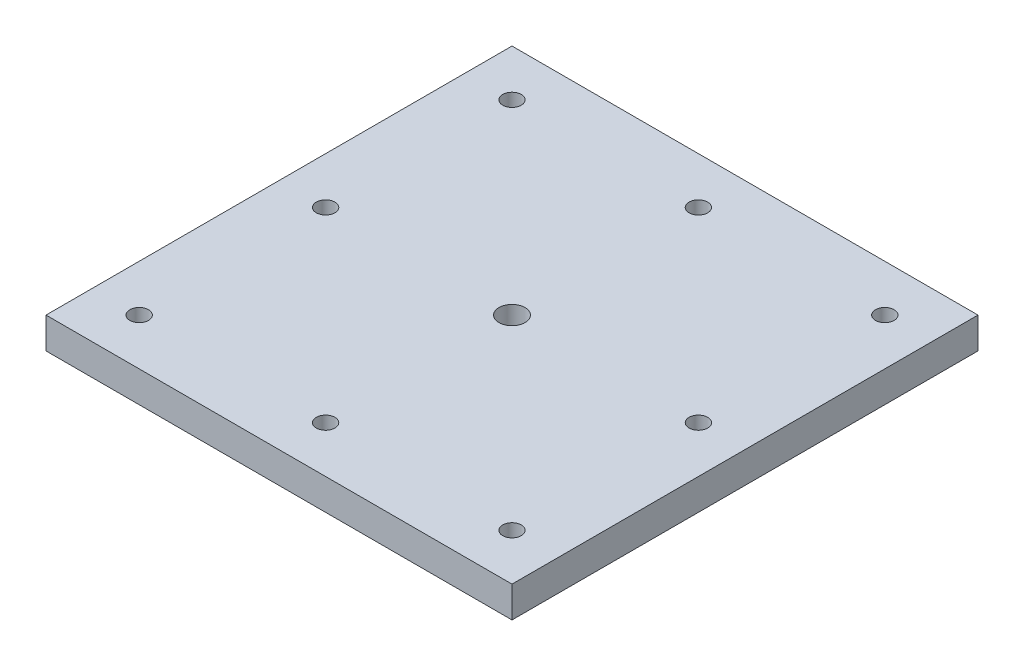
ISO-10303-21;
HEADER;
FILE_DESCRIPTION(('STEP AP214'),'2;1');
FILE_NAME('part.step','',(''),(''),'','','');
FILE_SCHEMA(('AUTOMOTIVE_DESIGN { 1 0 10303 214 1 1 1 1 }'));
ENDSEC;
DATA;
#1=APPLICATION_CONTEXT('core data for automotive mechanical design processes');
#2=APPLICATION_PROTOCOL_DEFINITION('international standard','automotive_design',2000,#1);
#3=PRODUCT_CONTEXT('',#1,'mechanical');
#4=PRODUCT('Part','Part','',(#3));
#5=PRODUCT_RELATED_PRODUCT_CATEGORY('part','',(#4));
#6=PRODUCT_DEFINITION_FORMATION('','',#4);
#7=PRODUCT_DEFINITION_CONTEXT('part definition',#1,'design');
#8=PRODUCT_DEFINITION('design','',#6,#7);
#9=PRODUCT_DEFINITION_SHAPE('','',#8);
#10=(LENGTH_UNIT() NAMED_UNIT(*) SI_UNIT(.MILLI.,.METRE.));
#11=(NAMED_UNIT(*) PLANE_ANGLE_UNIT() SI_UNIT($,.RADIAN.));
#12=(NAMED_UNIT(*) SI_UNIT($,.STERADIAN.) SOLID_ANGLE_UNIT());
#13=UNCERTAINTY_MEASURE_WITH_UNIT(LENGTH_MEASURE(1.E-05),#10,'distance_accuracy_value','');
#14=(GEOMETRIC_REPRESENTATION_CONTEXT(3) GLOBAL_UNCERTAINTY_ASSIGNED_CONTEXT((#13)) GLOBAL_UNIT_ASSIGNED_CONTEXT((#10,
#11,#12)) REPRESENTATION_CONTEXT('',''));
#15=CARTESIAN_POINT('',(0.,0.,0.));
#16=DIRECTION('',(0.,0.,1.));
#17=DIRECTION('',(1.,0.,0.));
#18=AXIS2_PLACEMENT_3D('',#15,#16,#17);
#19=CARTESIAN_POINT('',(0.,5.,0.));
#20=DIRECTION('',(0.,1.,0.));
#21=DIRECTION('',(0.,0.,1.));
#22=AXIS2_PLACEMENT_3D('',#19,#20,#21);
#23=PLANE('',#22);
#24=CARTESIAN_POINT('',(0.,5.,30.));
#25=DIRECTION('',(0.,1.,0.));
#26=DIRECTION('',(0.,0.,1.));
#27=AXIS2_PLACEMENT_3D('',#24,#25,#26);
#28=CIRCLE('',#27,1.5);
#29=CARTESIAN_POINT('',(0.,5.,31.5));
#30=VERTEX_POINT('',#29);
#31=EDGE_CURVE('E151',#30,#30,#28,.T.);
#32=ORIENTED_EDGE('',*,*,#31,.F.);
#33=EDGE_LOOP('',(#32));
#34=FACE_BOUND('',#33,.T.);
#35=CARTESIAN_POINT('',(-30.,5.,30.));
#36=DIRECTION('',(0.,1.,0.));
#37=DIRECTION('',(0.,0.,1.));
#38=AXIS2_PLACEMENT_3D('',#35,#36,#37);
#39=CIRCLE('',#38,1.5);
#40=CARTESIAN_POINT('',(-30.,5.,31.5));
#41=VERTEX_POINT('',#40);
#42=EDGE_CURVE('E139',#41,#41,#39,.T.);
#43=ORIENTED_EDGE('',*,*,#42,.F.);
#44=EDGE_LOOP('',(#43));
#45=FACE_BOUND('',#44,.T.);
#46=CARTESIAN_POINT('',(-30.,5.,-30.));
#47=DIRECTION('',(0.,1.,0.));
#48=DIRECTION('',(0.,0.,1.));
#49=AXIS2_PLACEMENT_3D('',#46,#47,#48);
#50=CIRCLE('',#49,1.5);
#51=CARTESIAN_POINT('',(-30.,5.,-28.5));
#52=VERTEX_POINT('',#51);
#53=EDGE_CURVE('E127',#52,#52,#50,.T.);
#54=ORIENTED_EDGE('',*,*,#53,.F.);
#55=EDGE_LOOP('',(#54));
#56=FACE_BOUND('',#55,.T.);
#57=CARTESIAN_POINT('',(30.,5.,-30.));
#58=DIRECTION('',(0.,1.,0.));
#59=DIRECTION('',(0.,0.,1.));
#60=AXIS2_PLACEMENT_3D('',#57,#58,#59);
#61=CIRCLE('',#60,1.5);
#62=CARTESIAN_POINT('',(30.,5.,-28.5));
#63=VERTEX_POINT('',#62);
#64=EDGE_CURVE('E115',#63,#63,#61,.T.);
#65=ORIENTED_EDGE('',*,*,#64,.F.);
#66=EDGE_LOOP('',(#65));
#67=FACE_BOUND('',#66,.T.);
#68=DIRECTION('',(0.,0.,-1.));
#69=VECTOR('',#68,1.);
#70=CARTESIAN_POINT('',(37.5,5.,-37.5));
#71=LINE('',#70,#69);
#72=CARTESIAN_POINT('',(37.5,5.,37.5));
#73=VERTEX_POINT('',#72);
#74=CARTESIAN_POINT('',(37.5,5.,-37.5));
#75=VERTEX_POINT('',#74);
#76=EDGE_CURVE('E85',#73,#75,#71,.T.);
#77=ORIENTED_EDGE('',*,*,#76,.T.);
#78=DIRECTION('',(-1.,0.,0.));
#79=VECTOR('',#78,1.);
#80=CARTESIAN_POINT('',(-37.5,5.,-37.5));
#81=LINE('',#80,#79);
#82=CARTESIAN_POINT('',(-37.5,5.,-37.5));
#83=VERTEX_POINT('',#82);
#84=EDGE_CURVE('E80',#75,#83,#81,.T.);
#85=ORIENTED_EDGE('',*,*,#84,.T.);
#86=DIRECTION('',(0.,0.,1.));
#87=VECTOR('',#86,1.);
#88=CARTESIAN_POINT('',(-37.5,5.,-37.5));
#89=LINE('',#88,#87);
#90=CARTESIAN_POINT('',(-37.5,5.,37.5));
#91=VERTEX_POINT('',#90);
#92=EDGE_CURVE('E83',#83,#91,#89,.T.);
#93=ORIENTED_EDGE('',*,*,#92,.T.);
#94=DIRECTION('',(1.,0.,0.));
#95=VECTOR('',#94,1.);
#96=CARTESIAN_POINT('',(-37.5,5.,37.5));
#97=LINE('',#96,#95);
#98=EDGE_CURVE('E50',#91,#73,#97,.T.);
#99=ORIENTED_EDGE('',*,*,#98,.T.);
#100=EDGE_LOOP('',(#77,#85,#93,#99));
#101=FACE_BOUND('',#100,.T.);
#102=CARTESIAN_POINT('',(30.,5.,0.));
#103=DIRECTION('',(0.,1.,0.));
#104=DIRECTION('',(0.,0.,1.));
#105=AXIS2_PLACEMENT_3D('',#102,#103,#104);
#106=CIRCLE('',#105,1.5);
#107=CARTESIAN_POINT('',(30.,5.,1.5));
#108=VERTEX_POINT('',#107);
#109=EDGE_CURVE('E100',#108,#108,#106,.T.);
#110=ORIENTED_EDGE('',*,*,#109,.F.);
#111=EDGE_LOOP('',(#110));
#112=FACE_BOUND('',#111,.T.);
#113=CARTESIAN_POINT('',(0.,5.,-30.));
#114=DIRECTION('',(0.,1.,0.));
#115=DIRECTION('',(0.,0.,1.));
#116=AXIS2_PLACEMENT_3D('',#113,#114,#115);
#117=CIRCLE('',#116,1.5);
#118=CARTESIAN_POINT('',(0.,5.,-28.5));
#119=VERTEX_POINT('',#118);
#120=EDGE_CURVE('E121',#119,#119,#117,.T.);
#121=ORIENTED_EDGE('',*,*,#120,.F.);
#122=EDGE_LOOP('',(#121));
#123=FACE_BOUND('',#122,.T.);
#124=CARTESIAN_POINT('',(-30.,5.,0.));
#125=DIRECTION('',(0.,1.,0.));
#126=DIRECTION('',(0.,0.,1.));
#127=AXIS2_PLACEMENT_3D('',#124,#125,#126);
#128=CIRCLE('',#127,1.5);
#129=CARTESIAN_POINT('',(-30.,5.,1.5));
#130=VERTEX_POINT('',#129);
#131=EDGE_CURVE('E133',#130,#130,#128,.T.);
#132=ORIENTED_EDGE('',*,*,#131,.F.);
#133=EDGE_LOOP('',(#132));
#134=FACE_BOUND('',#133,.T.);
#135=CARTESIAN_POINT('',(30.,5.,30.));
#136=DIRECTION('',(0.,1.,0.));
#137=DIRECTION('',(0.,0.,1.));
#138=AXIS2_PLACEMENT_3D('',#135,#136,#137);
#139=CIRCLE('',#138,1.5);
#140=CARTESIAN_POINT('',(30.,5.,31.5));
#141=VERTEX_POINT('',#140);
#142=EDGE_CURVE('E145',#141,#141,#139,.T.);
#143=ORIENTED_EDGE('',*,*,#142,.F.);
#144=EDGE_LOOP('',(#143));
#145=FACE_BOUND('',#144,.T.);
#146=CARTESIAN_POINT('',(0.,5.,0.));
#147=DIRECTION('',(0.,1.,0.));
#148=DIRECTION('',(0.,0.,1.));
#149=AXIS2_PLACEMENT_3D('',#146,#147,#148);
#150=CIRCLE('',#149,2.1);
#151=CARTESIAN_POINT('',(0.,5.,2.1));
#152=VERTEX_POINT('',#151);
#153=EDGE_CURVE('E157',#152,#152,#150,.T.);
#154=ORIENTED_EDGE('',*,*,#153,.F.);
#155=EDGE_LOOP('',(#154));
#156=FACE_BOUND('',#155,.T.);
#157=ADVANCED_FACE('F33',(#34,#45,#56,#67,#101,#112,#123,#134,#145,#156),#23,.T.);
#158=CARTESIAN_POINT('',(0.,0.,0.));
#159=DIRECTION('',(0.,1.,0.));
#160=DIRECTION('',(0.,0.,1.));
#161=AXIS2_PLACEMENT_3D('',#158,#159,#160);
#162=PLANE('',#161);
#163=DIRECTION('',(0.,0.,-1.));
#164=VECTOR('',#163,1.);
#165=CARTESIAN_POINT('',(37.5,0.,-37.5));
#166=LINE('',#165,#164);
#167=CARTESIAN_POINT('',(37.5,0.,37.5));
#168=VERTEX_POINT('',#167);
#169=CARTESIAN_POINT('',(37.5,0.,-37.5));
#170=VERTEX_POINT('',#169);
#171=EDGE_CURVE('E97',#168,#170,#166,.T.);
#172=ORIENTED_EDGE('',*,*,#171,.F.);
#173=DIRECTION('',(1.,0.,0.));
#174=VECTOR('',#173,1.);
#175=CARTESIAN_POINT('',(-37.5,0.,37.5));
#176=LINE('',#175,#174);
#177=CARTESIAN_POINT('',(-37.5,0.,37.5));
#178=VERTEX_POINT('',#177);
#179=EDGE_CURVE('E73',#178,#168,#176,.T.);
#180=ORIENTED_EDGE('',*,*,#179,.F.);
#181=DIRECTION('',(0.,0.,1.));
#182=VECTOR('',#181,1.);
#183=CARTESIAN_POINT('',(-37.5,0.,-37.5));
#184=LINE('',#183,#182);
#185=CARTESIAN_POINT('',(-37.5,0.,-37.5));
#186=VERTEX_POINT('',#185);
#187=EDGE_CURVE('E67',#186,#178,#184,.T.);
#188=ORIENTED_EDGE('',*,*,#187,.F.);
#189=DIRECTION('',(-1.,0.,0.));
#190=VECTOR('',#189,1.);
#191=CARTESIAN_POINT('',(-37.5,0.,-37.5));
#192=LINE('',#191,#190);
#193=EDGE_CURVE('E89',#170,#186,#192,.T.);
#194=ORIENTED_EDGE('',*,*,#193,.F.);
#195=EDGE_LOOP('',(#172,#180,#188,#194));
#196=FACE_BOUND('',#195,.T.);
#197=CARTESIAN_POINT('',(30.,0.,0.));
#198=DIRECTION('',(0.,1.,0.));
#199=DIRECTION('',(0.,0.,1.));
#200=AXIS2_PLACEMENT_3D('',#197,#198,#199);
#201=CIRCLE('',#200,1.5);
#202=CARTESIAN_POINT('',(30.,0.,1.5));
#203=VERTEX_POINT('',#202);
#204=EDGE_CURVE('E112',#203,#203,#201,.T.);
#205=ORIENTED_EDGE('',*,*,#204,.T.);
#206=EDGE_LOOP('',(#205));
#207=FACE_BOUND('',#206,.T.);
#208=CARTESIAN_POINT('',(30.,0.,-30.));
#209=DIRECTION('',(0.,1.,0.));
#210=DIRECTION('',(0.,0.,1.));
#211=AXIS2_PLACEMENT_3D('',#208,#209,#210);
#212=CIRCLE('',#211,1.5);
#213=CARTESIAN_POINT('',(30.,0.,-28.5));
#214=VERTEX_POINT('',#213);
#215=EDGE_CURVE('E118',#214,#214,#212,.T.);
#216=ORIENTED_EDGE('',*,*,#215,.T.);
#217=EDGE_LOOP('',(#216));
#218=FACE_BOUND('',#217,.T.);
#219=CARTESIAN_POINT('',(0.,0.,-30.));
#220=DIRECTION('',(0.,1.,0.));
#221=DIRECTION('',(0.,0.,1.));
#222=AXIS2_PLACEMENT_3D('',#219,#220,#221);
#223=CIRCLE('',#222,1.5);
#224=CARTESIAN_POINT('',(0.,0.,-28.5));
#225=VERTEX_POINT('',#224);
#226=EDGE_CURVE('E124',#225,#225,#223,.T.);
#227=ORIENTED_EDGE('',*,*,#226,.T.);
#228=EDGE_LOOP('',(#227));
#229=FACE_BOUND('',#228,.T.);
#230=CARTESIAN_POINT('',(-30.,0.,-30.));
#231=DIRECTION('',(0.,1.,0.));
#232=DIRECTION('',(0.,0.,1.));
#233=AXIS2_PLACEMENT_3D('',#230,#231,#232);
#234=CIRCLE('',#233,1.5);
#235=CARTESIAN_POINT('',(-30.,0.,-28.5));
#236=VERTEX_POINT('',#235);
#237=EDGE_CURVE('E130',#236,#236,#234,.T.);
#238=ORIENTED_EDGE('',*,*,#237,.T.);
#239=EDGE_LOOP('',(#238));
#240=FACE_BOUND('',#239,.T.);
#241=CARTESIAN_POINT('',(-30.,0.,0.));
#242=DIRECTION('',(0.,1.,0.));
#243=DIRECTION('',(0.,0.,1.));
#244=AXIS2_PLACEMENT_3D('',#241,#242,#243);
#245=CIRCLE('',#244,1.5);
#246=CARTESIAN_POINT('',(-30.,0.,1.5));
#247=VERTEX_POINT('',#246);
#248=EDGE_CURVE('E136',#247,#247,#245,.T.);
#249=ORIENTED_EDGE('',*,*,#248,.T.);
#250=EDGE_LOOP('',(#249));
#251=FACE_BOUND('',#250,.T.);
#252=CARTESIAN_POINT('',(-30.,0.,30.));
#253=DIRECTION('',(0.,1.,0.));
#254=DIRECTION('',(0.,0.,1.));
#255=AXIS2_PLACEMENT_3D('',#252,#253,#254);
#256=CIRCLE('',#255,1.5);
#257=CARTESIAN_POINT('',(-30.,0.,31.5));
#258=VERTEX_POINT('',#257);
#259=EDGE_CURVE('E142',#258,#258,#256,.T.);
#260=ORIENTED_EDGE('',*,*,#259,.T.);
#261=EDGE_LOOP('',(#260));
#262=FACE_BOUND('',#261,.T.);
#263=CARTESIAN_POINT('',(30.,0.,30.));
#264=DIRECTION('',(0.,1.,0.));
#265=DIRECTION('',(0.,0.,1.));
#266=AXIS2_PLACEMENT_3D('',#263,#264,#265);
#267=CIRCLE('',#266,1.5);
#268=CARTESIAN_POINT('',(30.,0.,31.5));
#269=VERTEX_POINT('',#268);
#270=EDGE_CURVE('E148',#269,#269,#267,.T.);
#271=ORIENTED_EDGE('',*,*,#270,.T.);
#272=EDGE_LOOP('',(#271));
#273=FACE_BOUND('',#272,.T.);
#274=CARTESIAN_POINT('',(0.,0.,30.));
#275=DIRECTION('',(0.,1.,0.));
#276=DIRECTION('',(0.,0.,1.));
#277=AXIS2_PLACEMENT_3D('',#274,#275,#276);
#278=CIRCLE('',#277,1.5);
#279=CARTESIAN_POINT('',(0.,0.,31.5));
#280=VERTEX_POINT('',#279);
#281=EDGE_CURVE('E154',#280,#280,#278,.T.);
#282=ORIENTED_EDGE('',*,*,#281,.T.);
#283=EDGE_LOOP('',(#282));
#284=FACE_BOUND('',#283,.T.);
#285=CARTESIAN_POINT('',(0.,0.,0.));
#286=DIRECTION('',(0.,1.,0.));
#287=DIRECTION('',(0.,0.,1.));
#288=AXIS2_PLACEMENT_3D('',#285,#286,#287);
#289=CIRCLE('',#288,2.1);
#290=CARTESIAN_POINT('',(0.,0.,2.1));
#291=VERTEX_POINT('',#290);
#292=EDGE_CURVE('E160',#291,#291,#289,.T.);
#293=ORIENTED_EDGE('',*,*,#292,.T.);
#294=EDGE_LOOP('',(#293));
#295=FACE_BOUND('',#294,.T.);
#296=ADVANCED_FACE('F108',(#196,#207,#218,#229,#240,#251,#262,#273,#284,#295),#162,.F.);
#297=CARTESIAN_POINT('',(37.5,5.,-37.5));
#298=DIRECTION('',(-1.,0.,0.));
#299=DIRECTION('',(0.,0.,1.));
#300=AXIS2_PLACEMENT_3D('',#297,#298,#299);
#301=PLANE('',#300);
#302=ORIENTED_EDGE('',*,*,#171,.T.);
#303=DIRECTION('',(0.,-1.,0.));
#304=VECTOR('',#303,1.);
#305=CARTESIAN_POINT('',(37.5,5.,-37.5));
#306=LINE('',#305,#304);
#307=EDGE_CURVE('E11',#75,#170,#306,.T.);
#308=ORIENTED_EDGE('',*,*,#307,.F.);
#309=ORIENTED_EDGE('',*,*,#76,.F.);
#310=DIRECTION('',(0.,-1.,0.));
#311=VECTOR('',#310,1.);
#312=CARTESIAN_POINT('',(37.5,5.,37.5));
#313=LINE('',#312,#311);
#314=EDGE_CURVE('E93',#73,#168,#313,.T.);
#315=ORIENTED_EDGE('',*,*,#314,.T.);
#316=EDGE_LOOP('',(#302,#308,#309,#315));
#317=FACE_BOUND('',#316,.T.);
#318=ADVANCED_FACE('F35',(#317),#301,.F.);
#319=CARTESIAN_POINT('',(-37.5,5.,-37.5));
#320=DIRECTION('',(0.,0.,1.));
#321=DIRECTION('',(1.,0.,0.));
#322=AXIS2_PLACEMENT_3D('',#319,#320,#321);
#323=PLANE('',#322);
#324=ORIENTED_EDGE('',*,*,#193,.T.);
#325=DIRECTION('',(0.,-1.,0.));
#326=VECTOR('',#325,1.);
#327=CARTESIAN_POINT('',(-37.5,5.,-37.5));
#328=LINE('',#327,#326);
#329=EDGE_CURVE('E42',#83,#186,#328,.T.);
#330=ORIENTED_EDGE('',*,*,#329,.F.);
#331=ORIENTED_EDGE('',*,*,#84,.F.);
#332=ORIENTED_EDGE('',*,*,#307,.T.);
#333=EDGE_LOOP('',(#324,#330,#331,#332));
#334=FACE_BOUND('',#333,.T.);
#335=ADVANCED_FACE('F88',(#334),#323,.F.);
#336=CARTESIAN_POINT('',(-37.5,5.,-37.5));
#337=DIRECTION('',(1.,0.,0.));
#338=DIRECTION('',(0.,0.,-1.));
#339=AXIS2_PLACEMENT_3D('',#336,#337,#338);
#340=PLANE('',#339);
#341=ORIENTED_EDGE('',*,*,#187,.T.);
#342=DIRECTION('',(0.,-1.,0.));
#343=VECTOR('',#342,1.);
#344=CARTESIAN_POINT('',(-37.5,5.,37.5));
#345=LINE('',#344,#343);
#346=EDGE_CURVE('E90',#91,#178,#345,.T.);
#347=ORIENTED_EDGE('',*,*,#346,.F.);
#348=ORIENTED_EDGE('',*,*,#92,.F.);
#349=ORIENTED_EDGE('',*,*,#329,.T.);
#350=EDGE_LOOP('',(#341,#347,#348,#349));
#351=FACE_BOUND('',#350,.T.);
#352=ADVANCED_FACE('F91',(#351),#340,.F.);
#353=CARTESIAN_POINT('',(-37.5,5.,37.5));
#354=DIRECTION('',(0.,0.,-1.));
#355=DIRECTION('',(-1.,0.,0.));
#356=AXIS2_PLACEMENT_3D('',#353,#354,#355);
#357=PLANE('',#356);
#358=ORIENTED_EDGE('',*,*,#179,.T.);
#359=ORIENTED_EDGE('',*,*,#314,.F.);
#360=ORIENTED_EDGE('',*,*,#98,.F.);
#361=ORIENTED_EDGE('',*,*,#346,.T.);
#362=EDGE_LOOP('',(#358,#359,#360,#361));
#363=FACE_BOUND('',#362,.T.);
#364=ADVANCED_FACE('F105',(#363),#357,.F.);
#365=CARTESIAN_POINT('',(30.,5.,0.));
#366=DIRECTION('',(0.,-1.,0.));
#367=DIRECTION('',(0.,0.,-1.));
#368=AXIS2_PLACEMENT_3D('',#365,#366,#367);
#369=CYLINDRICAL_SURFACE('',#368,1.5);
#370=ORIENTED_EDGE('',*,*,#109,.T.);
#371=EDGE_LOOP('',(#370));
#372=FACE_BOUND('',#371,.T.);
#373=ORIENTED_EDGE('',*,*,#204,.F.);
#374=EDGE_LOOP('',(#373));
#375=FACE_BOUND('',#374,.T.);
#376=ADVANCED_FACE('F179',(#372,#375),#369,.F.);
#377=CARTESIAN_POINT('',(30.,5.,-30.));
#378=DIRECTION('',(0.,-1.,0.));
#379=DIRECTION('',(0.,0.,-1.));
#380=AXIS2_PLACEMENT_3D('',#377,#378,#379);
#381=CYLINDRICAL_SURFACE('',#380,1.5);
#382=ORIENTED_EDGE('',*,*,#64,.T.);
#383=EDGE_LOOP('',(#382));
#384=FACE_BOUND('',#383,.T.);
#385=ORIENTED_EDGE('',*,*,#215,.F.);
#386=EDGE_LOOP('',(#385));
#387=FACE_BOUND('',#386,.T.);
#388=ADVANCED_FACE('F225',(#384,#387),#381,.F.);
#389=CARTESIAN_POINT('',(0.,5.,-30.));
#390=DIRECTION('',(0.,-1.,0.));
#391=DIRECTION('',(0.,0.,-1.));
#392=AXIS2_PLACEMENT_3D('',#389,#390,#391);
#393=CYLINDRICAL_SURFACE('',#392,1.5);
#394=ORIENTED_EDGE('',*,*,#120,.T.);
#395=EDGE_LOOP('',(#394));
#396=FACE_BOUND('',#395,.T.);
#397=ORIENTED_EDGE('',*,*,#226,.F.);
#398=EDGE_LOOP('',(#397));
#399=FACE_BOUND('',#398,.T.);
#400=ADVANCED_FACE('F233',(#396,#399),#393,.F.);
#401=CARTESIAN_POINT('',(-30.,5.,-30.));
#402=DIRECTION('',(0.,-1.,0.));
#403=DIRECTION('',(0.,0.,-1.));
#404=AXIS2_PLACEMENT_3D('',#401,#402,#403);
#405=CYLINDRICAL_SURFACE('',#404,1.5);
#406=ORIENTED_EDGE('',*,*,#53,.T.);
#407=EDGE_LOOP('',(#406));
#408=FACE_BOUND('',#407,.T.);
#409=ORIENTED_EDGE('',*,*,#237,.F.);
#410=EDGE_LOOP('',(#409));
#411=FACE_BOUND('',#410,.T.);
#412=ADVANCED_FACE('F241',(#408,#411),#405,.F.);
#413=CARTESIAN_POINT('',(-30.,5.,0.));
#414=DIRECTION('',(0.,-1.,0.));
#415=DIRECTION('',(0.,0.,-1.));
#416=AXIS2_PLACEMENT_3D('',#413,#414,#415);
#417=CYLINDRICAL_SURFACE('',#416,1.5);
#418=ORIENTED_EDGE('',*,*,#131,.T.);
#419=EDGE_LOOP('',(#418));
#420=FACE_BOUND('',#419,.T.);
#421=ORIENTED_EDGE('',*,*,#248,.F.);
#422=EDGE_LOOP('',(#421));
#423=FACE_BOUND('',#422,.T.);
#424=ADVANCED_FACE('F250',(#420,#423),#417,.F.);
#425=CARTESIAN_POINT('',(-30.,5.,30.));
#426=DIRECTION('',(0.,-1.,0.));
#427=DIRECTION('',(0.,0.,-1.));
#428=AXIS2_PLACEMENT_3D('',#425,#426,#427);
#429=CYLINDRICAL_SURFACE('',#428,1.5);
#430=ORIENTED_EDGE('',*,*,#42,.T.);
#431=EDGE_LOOP('',(#430));
#432=FACE_BOUND('',#431,.T.);
#433=ORIENTED_EDGE('',*,*,#259,.F.);
#434=EDGE_LOOP('',(#433));
#435=FACE_BOUND('',#434,.T.);
#436=ADVANCED_FACE('F259',(#432,#435),#429,.F.);
#437=CARTESIAN_POINT('',(30.,5.,30.));
#438=DIRECTION('',(0.,-1.,0.));
#439=DIRECTION('',(0.,0.,-1.));
#440=AXIS2_PLACEMENT_3D('',#437,#438,#439);
#441=CYLINDRICAL_SURFACE('',#440,1.5);
#442=ORIENTED_EDGE('',*,*,#142,.T.);
#443=EDGE_LOOP('',(#442));
#444=FACE_BOUND('',#443,.T.);
#445=ORIENTED_EDGE('',*,*,#270,.F.);
#446=EDGE_LOOP('',(#445));
#447=FACE_BOUND('',#446,.T.);
#448=ADVANCED_FACE('F268',(#444,#447),#441,.F.);
#449=CARTESIAN_POINT('',(0.,5.,30.));
#450=DIRECTION('',(0.,-1.,0.));
#451=DIRECTION('',(0.,0.,-1.));
#452=AXIS2_PLACEMENT_3D('',#449,#450,#451);
#453=CYLINDRICAL_SURFACE('',#452,1.5);
#454=ORIENTED_EDGE('',*,*,#31,.T.);
#455=EDGE_LOOP('',(#454));
#456=FACE_BOUND('',#455,.T.);
#457=ORIENTED_EDGE('',*,*,#281,.F.);
#458=EDGE_LOOP('',(#457));
#459=FACE_BOUND('',#458,.T.);
#460=ADVANCED_FACE('F277',(#456,#459),#453,.F.);
#461=CARTESIAN_POINT('',(0.,5.,0.));
#462=DIRECTION('',(0.,-1.,0.));
#463=DIRECTION('',(0.,0.,-1.));
#464=AXIS2_PLACEMENT_3D('',#461,#462,#463);
#465=CYLINDRICAL_SURFACE('',#464,2.1);
#466=ORIENTED_EDGE('',*,*,#153,.T.);
#467=EDGE_LOOP('',(#466));
#468=FACE_BOUND('',#467,.T.);
#469=ORIENTED_EDGE('',*,*,#292,.F.);
#470=EDGE_LOOP('',(#469));
#471=FACE_BOUND('',#470,.T.);
#472=ADVANCED_FACE('F166',(#468,#471),#465,.F.);
#473=CLOSED_SHELL('',(#157,#296,#318,#335,#352,#364,#376,#388,#400,#412,#424,#436,#448,#460,#472));
#474=MANIFOLD_SOLID_BREP('B2',#473);
#475=ADVANCED_BREP_SHAPE_REPRESENTATION('',(#18,#474),#14);
#476=SHAPE_DEFINITION_REPRESENTATION(#9,#475);
ENDSEC;
END-ISO-10303-21;
